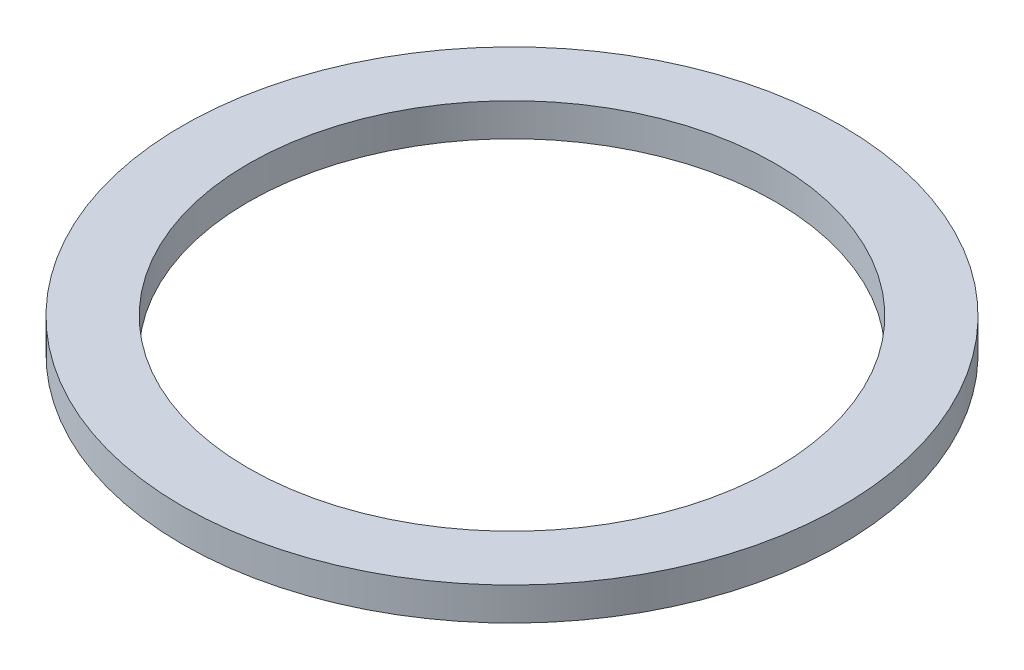
ISO-10303-21;
HEADER;
FILE_DESCRIPTION(('STEP AP214'),'2;1');
FILE_NAME('part.step','',(''),(''),'','','');
FILE_SCHEMA(('AUTOMOTIVE_DESIGN { 1 0 10303 214 1 1 1 1 }'));
ENDSEC;
DATA;
#1=APPLICATION_CONTEXT('core data for automotive mechanical design processes');
#2=APPLICATION_PROTOCOL_DEFINITION('international standard','automotive_design',2000,#1);
#3=PRODUCT_CONTEXT('',#1,'mechanical');
#4=PRODUCT('Part','Part','',(#3));
#5=PRODUCT_RELATED_PRODUCT_CATEGORY('part','',(#4));
#6=PRODUCT_DEFINITION_FORMATION('','',#4);
#7=PRODUCT_DEFINITION_CONTEXT('part definition',#1,'design');
#8=PRODUCT_DEFINITION('design','',#6,#7);
#9=PRODUCT_DEFINITION_SHAPE('','',#8);
#10=(LENGTH_UNIT() NAMED_UNIT(*) SI_UNIT(.MILLI.,.METRE.));
#11=(NAMED_UNIT(*) PLANE_ANGLE_UNIT() SI_UNIT($,.RADIAN.));
#12=(NAMED_UNIT(*) SI_UNIT($,.STERADIAN.) SOLID_ANGLE_UNIT());
#13=UNCERTAINTY_MEASURE_WITH_UNIT(LENGTH_MEASURE(1.E-05),#10,'distance_accuracy_value','');
#14=(GEOMETRIC_REPRESENTATION_CONTEXT(3) GLOBAL_UNCERTAINTY_ASSIGNED_CONTEXT((#13)) GLOBAL_UNIT_ASSIGNED_CONTEXT((#10,
#11,#12)) REPRESENTATION_CONTEXT('',''));
#15=CARTESIAN_POINT('',(0.,0.,0.));
#16=DIRECTION('',(0.,0.,1.));
#17=DIRECTION('',(1.,0.,0.));
#18=AXIS2_PLACEMENT_3D('',#15,#16,#17);
#19=CARTESIAN_POINT('',(0.,5.,0.));
#20=DIRECTION('',(0.,1.,0.));
#21=DIRECTION('',(0.,0.,1.));
#22=AXIS2_PLACEMENT_3D('',#19,#20,#21);
#23=PLANE('',#22);
#24=CARTESIAN_POINT('',(0.,5.,0.));
#25=DIRECTION('',(0.,1.,0.));
#26=DIRECTION('',(0.,0.,1.));
#27=AXIS2_PLACEMENT_3D('',#24,#25,#26);
#28=CIRCLE('',#27,50.);
#29=CARTESIAN_POINT('',(0.,5.,50.));
#30=VERTEX_POINT('',#29);
#31=EDGE_CURVE('E10',#30,#30,#28,.T.);
#32=ORIENTED_EDGE('',*,*,#31,.T.);
#33=EDGE_LOOP('',(#32));
#34=FACE_BOUND('',#33,.T.);
#35=CARTESIAN_POINT('',(0.,5.,0.));
#36=DIRECTION('',(0.,1.,0.));
#37=DIRECTION('',(0.,0.,1.));
#38=AXIS2_PLACEMENT_3D('',#35,#36,#37);
#39=CIRCLE('',#38,40.);
#40=CARTESIAN_POINT('',(0.,5.,40.));
#41=VERTEX_POINT('',#40);
#42=EDGE_CURVE('E54',#41,#41,#39,.T.);
#43=ORIENTED_EDGE('',*,*,#42,.F.);
#44=EDGE_LOOP('',(#43));
#45=FACE_BOUND('',#44,.T.);
#46=ADVANCED_FACE('F41',(#34,#45),#23,.T.);
#47=CARTESIAN_POINT('',(0.,0.,0.));
#48=DIRECTION('',(0.,1.,0.));
#49=DIRECTION('',(0.,0.,1.));
#50=AXIS2_PLACEMENT_3D('',#47,#48,#49);
#51=PLANE('',#50);
#52=CARTESIAN_POINT('',(0.,0.,0.));
#53=DIRECTION('',(0.,1.,0.));
#54=DIRECTION('',(0.,0.,1.));
#55=AXIS2_PLACEMENT_3D('',#52,#53,#54);
#56=CIRCLE('',#55,50.);
#57=CARTESIAN_POINT('',(0.,0.,50.));
#58=VERTEX_POINT('',#57);
#59=EDGE_CURVE('E45',#58,#58,#56,.T.);
#60=ORIENTED_EDGE('',*,*,#59,.F.);
#61=EDGE_LOOP('',(#60));
#62=FACE_BOUND('',#61,.T.);
#63=CARTESIAN_POINT('',(0.,0.,0.));
#64=DIRECTION('',(0.,1.,0.));
#65=DIRECTION('',(0.,0.,1.));
#66=AXIS2_PLACEMENT_3D('',#63,#64,#65);
#67=CIRCLE('',#66,40.);
#68=CARTESIAN_POINT('',(0.,0.,40.));
#69=VERTEX_POINT('',#68);
#70=EDGE_CURVE('E56',#69,#69,#67,.T.);
#71=ORIENTED_EDGE('',*,*,#70,.T.);
#72=EDGE_LOOP('',(#71));
#73=FACE_BOUND('',#72,.T.);
#74=ADVANCED_FACE('F68',(#62,#73),#51,.F.);
#75=CARTESIAN_POINT('',(0.,5.,0.));
#76=DIRECTION('',(0.,-1.,0.));
#77=DIRECTION('',(0.,0.,-1.));
#78=AXIS2_PLACEMENT_3D('',#75,#76,#77);
#79=CYLINDRICAL_SURFACE('',#78,50.);
#80=ORIENTED_EDGE('',*,*,#31,.F.);
#81=EDGE_LOOP('',(#80));
#82=FACE_BOUND('',#81,.T.);
#83=ORIENTED_EDGE('',*,*,#59,.T.);
#84=EDGE_LOOP('',(#83));
#85=FACE_BOUND('',#84,.T.);
#86=ADVANCED_FACE('F43',(#82,#85),#79,.T.);
#87=CARTESIAN_POINT('',(0.,5.,0.));
#88=DIRECTION('',(0.,-1.,0.));
#89=DIRECTION('',(0.,0.,-1.));
#90=AXIS2_PLACEMENT_3D('',#87,#88,#89);
#91=CYLINDRICAL_SURFACE('',#90,40.);
#92=ORIENTED_EDGE('',*,*,#42,.T.);
#93=EDGE_LOOP('',(#92));
#94=FACE_BOUND('',#93,.T.);
#95=ORIENTED_EDGE('',*,*,#70,.F.);
#96=EDGE_LOOP('',(#95));
#97=FACE_BOUND('',#96,.T.);
#98=ADVANCED_FACE('F64',(#94,#97),#91,.F.);
#99=CLOSED_SHELL('',(#46,#74,#86,#98));
#100=MANIFOLD_SOLID_BREP('B2',#99);
#101=ADVANCED_BREP_SHAPE_REPRESENTATION('',(#18,#100),#14);
#102=SHAPE_DEFINITION_REPRESENTATION(#9,#101);
ENDSEC;
END-ISO-10303-21;
